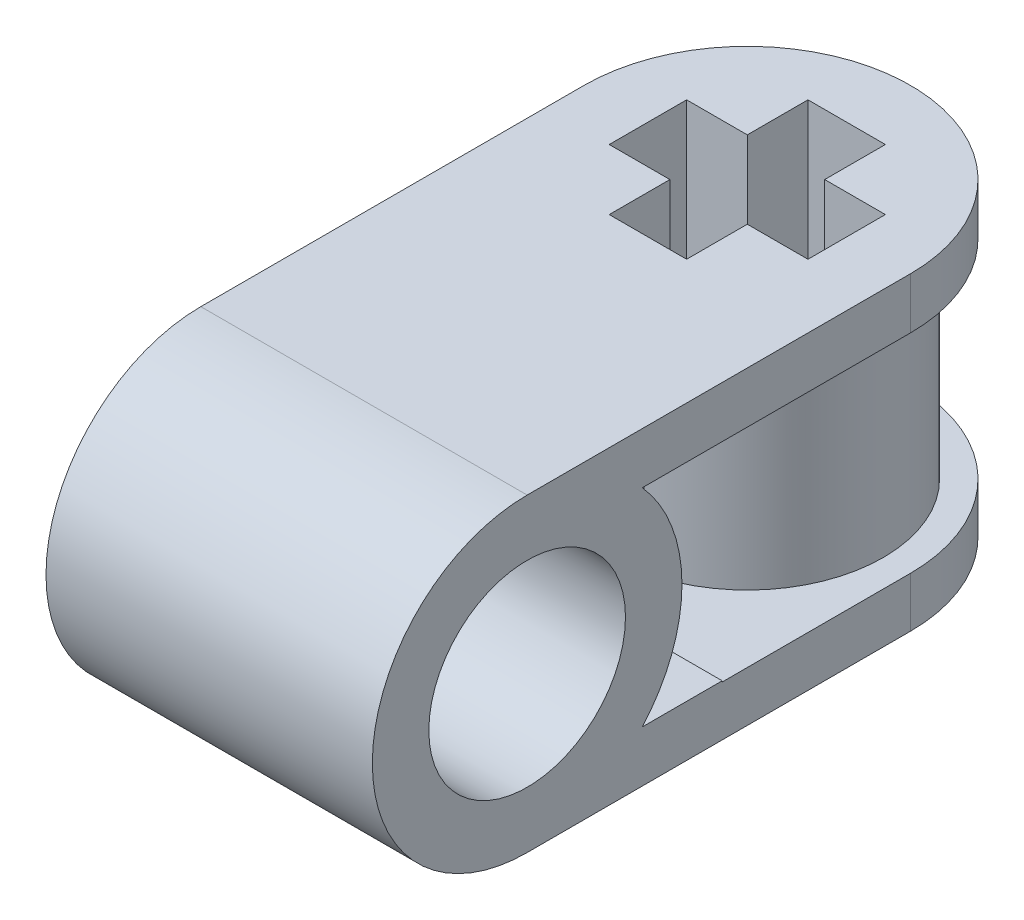
ISO-10303-21;
HEADER;
FILE_DESCRIPTION(('STEP AP214'),'2;1');
FILE_NAME('part.step','',(''),(''),'','','');
FILE_SCHEMA(('AUTOMOTIVE_DESIGN { 1 0 10303 214 1 1 1 1 }'));
ENDSEC;
DATA;
#1=APPLICATION_CONTEXT('core data for automotive mechanical design processes');
#2=APPLICATION_PROTOCOL_DEFINITION('international standard','automotive_design',2000,#1);
#3=PRODUCT_CONTEXT('',#1,'mechanical');
#4=PRODUCT('Part','Part','',(#3));
#5=PRODUCT_RELATED_PRODUCT_CATEGORY('part','',(#4));
#6=PRODUCT_DEFINITION_FORMATION('','',#4);
#7=PRODUCT_DEFINITION_CONTEXT('part definition',#1,'design');
#8=PRODUCT_DEFINITION('design','',#6,#7);
#9=PRODUCT_DEFINITION_SHAPE('','',#8);
#10=(LENGTH_UNIT() NAMED_UNIT(*) SI_UNIT(.MILLI.,.METRE.));
#11=(NAMED_UNIT(*) PLANE_ANGLE_UNIT() SI_UNIT($,.RADIAN.));
#12=(NAMED_UNIT(*) SI_UNIT($,.STERADIAN.) SOLID_ANGLE_UNIT());
#13=UNCERTAINTY_MEASURE_WITH_UNIT(LENGTH_MEASURE(1.E-05),#10,'distance_accuracy_value','');
#14=(GEOMETRIC_REPRESENTATION_CONTEXT(3) GLOBAL_UNCERTAINTY_ASSIGNED_CONTEXT((#13)) GLOBAL_UNIT_ASSIGNED_CONTEXT((#10,
#11,#12)) REPRESENTATION_CONTEXT('',''));
#15=CARTESIAN_POINT('',(0.,0.,0.));
#16=DIRECTION('',(0.,0.,1.));
#17=DIRECTION('',(1.,0.,0.));
#18=AXIS2_PLACEMENT_3D('',#15,#16,#17);
#19=CARTESIAN_POINT('',(7.8,-3.69999873615607,0.));
#20=DIRECTION('',(0.,1.,0.));
#21=DIRECTION('',(0.,0.,1.));
#22=AXIS2_PLACEMENT_3D('',#19,#20,#21);
#23=PLANE('',#22);
#24=DIRECTION('',(1.,0.,0.));
#25=VECTOR('',#24,1.);
#26=CARTESIAN_POINT('',(7.79999999999999,-3.69999873615607,-14.7865384615385));
#27=LINE('',#26,#25);
#28=CARTESIAN_POINT('',(2.975,-3.69999873615607,-14.7865384615385));
#29=VERTEX_POINT('',#28);
#30=CARTESIAN_POINT('',(4.825,-3.69999873615607,-14.7865384615385));
#31=VERTEX_POINT('',#30);
#32=EDGE_CURVE('E410',#29,#31,#27,.T.);
#33=ORIENTED_EDGE('',*,*,#32,.T.);
#34=DIRECTION('',(0.,0.,-1.));
#35=VECTOR('',#34,1.);
#36=CARTESIAN_POINT('',(4.825,-3.69999873615607,0.));
#37=LINE('',#36,#35);
#38=CARTESIAN_POINT('',(4.825,-3.69999873615607,-16.2365384615385));
#39=VERTEX_POINT('',#38);
#40=EDGE_CURVE('E412',#31,#39,#37,.T.);
#41=ORIENTED_EDGE('',*,*,#40,.T.);
#42=DIRECTION('',(-1.,0.,0.));
#43=VECTOR('',#42,1.);
#44=CARTESIAN_POINT('',(7.8,-3.69999873615607,-16.2365384615385));
#45=LINE('',#44,#43);
#46=CARTESIAN_POINT('',(6.275,-3.69999873615607,-16.2365384615385));
#47=VERTEX_POINT('',#46);
#48=EDGE_CURVE('E519',#47,#39,#45,.T.);
#49=ORIENTED_EDGE('',*,*,#48,.F.);
#50=DIRECTION('',(0.,0.,-1.));
#51=VECTOR('',#50,1.);
#52=CARTESIAN_POINT('',(6.275,-3.69999873615607,0.));
#53=LINE('',#52,#51);
#54=CARTESIAN_POINT('',(6.275,-3.69999873615607,-18.0865384615385));
#55=VERTEX_POINT('',#54);
#56=EDGE_CURVE('E541',#47,#55,#53,.T.);
#57=ORIENTED_EDGE('',*,*,#56,.T.);
#58=DIRECTION('',(-1.,0.,0.));
#59=VECTOR('',#58,1.);
#60=CARTESIAN_POINT('',(7.8,-3.69999873615607,-18.0865384615385));
#61=LINE('',#60,#59);
#62=CARTESIAN_POINT('',(4.825,-3.69999873615607,-18.0865384615385));
#63=VERTEX_POINT('',#62);
#64=EDGE_CURVE('E544',#55,#63,#61,.T.);
#65=ORIENTED_EDGE('',*,*,#64,.T.);
#66=DIRECTION('',(0.,0.,-1.));
#67=VECTOR('',#66,1.);
#68=CARTESIAN_POINT('',(4.825,-3.69999873615607,0.));
#69=LINE('',#68,#67);
#70=CARTESIAN_POINT('',(4.825,-3.69999873615607,-19.5365384615385));
#71=VERTEX_POINT('',#70);
#72=EDGE_CURVE('E547',#63,#71,#69,.T.);
#73=ORIENTED_EDGE('',*,*,#72,.T.);
#74=DIRECTION('',(1.,0.,0.));
#75=VECTOR('',#74,1.);
#76=CARTESIAN_POINT('',(7.8,-3.69999873615607,-19.5365384615385));
#77=LINE('',#76,#75);
#78=CARTESIAN_POINT('',(2.975,-3.69999873615607,-19.5365384615385));
#79=VERTEX_POINT('',#78);
#80=EDGE_CURVE('E550',#79,#71,#77,.T.);
#81=ORIENTED_EDGE('',*,*,#80,.F.);
#82=DIRECTION('',(0.,0.,-1.));
#83=VECTOR('',#82,1.);
#84=CARTESIAN_POINT('',(2.975,-3.69999873615607,0.));
#85=LINE('',#84,#83);
#86=CARTESIAN_POINT('',(2.975,-3.69999873615607,-18.0865384615385));
#87=VERTEX_POINT('',#86);
#88=EDGE_CURVE('E552',#87,#79,#85,.T.);
#89=ORIENTED_EDGE('',*,*,#88,.F.);
#90=DIRECTION('',(-1.,0.,0.));
#91=VECTOR('',#90,1.);
#92=CARTESIAN_POINT('',(7.8,-3.69999873615607,-18.0865384615385));
#93=LINE('',#92,#91);
#94=CARTESIAN_POINT('',(1.525,-3.69999873615607,-18.0865384615385));
#95=VERTEX_POINT('',#94);
#96=EDGE_CURVE('E554',#87,#95,#93,.T.);
#97=ORIENTED_EDGE('',*,*,#96,.T.);
#98=DIRECTION('',(0.,0.,-1.));
#99=VECTOR('',#98,1.);
#100=CARTESIAN_POINT('',(1.525,-3.69999873615607,0.));
#101=LINE('',#100,#99);
#102=CARTESIAN_POINT('',(1.525,-3.69999873615607,-16.2365384615385));
#103=VERTEX_POINT('',#102);
#104=EDGE_CURVE('E557',#103,#95,#101,.T.);
#105=ORIENTED_EDGE('',*,*,#104,.F.);
#106=DIRECTION('',(-1.,0.,0.));
#107=VECTOR('',#106,1.);
#108=CARTESIAN_POINT('',(7.8,-3.69999873615607,-16.2365384615385));
#109=LINE('',#108,#107);
#110=CARTESIAN_POINT('',(2.975,-3.69999873615607,-16.2365384615385));
#111=VERTEX_POINT('',#110);
#112=EDGE_CURVE('E420',#111,#103,#109,.T.);
#113=ORIENTED_EDGE('',*,*,#112,.F.);
#114=DIRECTION('',(0.,0.,-1.));
#115=VECTOR('',#114,1.);
#116=CARTESIAN_POINT('',(2.975,-3.69999873615607,0.));
#117=LINE('',#116,#115);
#118=EDGE_CURVE('E414',#29,#111,#117,.T.);
#119=ORIENTED_EDGE('',*,*,#118,.F.);
#120=EDGE_LOOP('',(#33,#41,#49,#57,#65,#73,#81,#89,#97,#105,#113,#119));
#121=FACE_BOUND('',#120,.T.);
#122=DIRECTION('',(1.,0.,0.));
#123=VECTOR('',#122,1.);
#124=CARTESIAN_POINT('',(-2.2,-3.69999873615607,-8.));
#125=LINE('',#124,#123);
#126=CARTESIAN_POINT('',(0.,-3.69999873615607,-8.));
#127=VERTEX_POINT('',#126);
#128=CARTESIAN_POINT('',(7.8,-3.69999873615607,-8.));
#129=VERTEX_POINT('',#128);
#130=EDGE_CURVE('E227',#127,#129,#125,.T.);
#131=ORIENTED_EDGE('',*,*,#130,.F.);
#132=DIRECTION('',(0.,0.,-1.));
#133=VECTOR('',#132,1.);
#134=CARTESIAN_POINT('',(0.,-3.69999873615607,0.));
#135=LINE('',#134,#133);
#136=CARTESIAN_POINT('',(0.,-3.69999873615607,-17.1615384615385));
#137=VERTEX_POINT('',#136);
#138=EDGE_CURVE('E314',#127,#137,#135,.T.);
#139=ORIENTED_EDGE('',*,*,#138,.T.);
#140=CARTESIAN_POINT('',(3.9,-3.69999873615607,-17.1615384615385));
#141=DIRECTION('',(0.,1.,0.));
#142=DIRECTION('',(0.,0.,1.));
#143=AXIS2_PLACEMENT_3D('',#140,#141,#142);
#144=CIRCLE('',#143,3.9);
#145=CARTESIAN_POINT('',(7.8,-3.69999873615607,-17.1615384615385));
#146=VERTEX_POINT('',#145);
#147=EDGE_CURVE('E262',#146,#137,#144,.T.);
#148=ORIENTED_EDGE('',*,*,#147,.F.);
#149=DIRECTION('',(0.,0.,-1.));
#150=VECTOR('',#149,1.);
#151=CARTESIAN_POINT('',(7.8,-3.69999873615607,0.));
#152=LINE('',#151,#150);
#153=EDGE_CURVE('E42',#129,#146,#152,.T.);
#154=ORIENTED_EDGE('',*,*,#153,.F.);
#155=EDGE_LOOP('',(#131,#139,#148,#154));
#156=FACE_BOUND('',#155,.T.);
#157=ADVANCED_FACE('F34',(#121,#156),#23,.F.);
#158=CARTESIAN_POINT('',(7.8,0.,0.));
#159=DIRECTION('',(1.,0.,0.));
#160=DIRECTION('',(0.,0.,-1.));
#161=AXIS2_PLACEMENT_3D('',#158,#159,#160);
#162=PLANE('',#161);
#163=CARTESIAN_POINT('',(7.8,0.,-8.));
#164=DIRECTION('',(1.,0.,0.));
#165=DIRECTION('',(0.,0.,-1.));
#166=AXIS2_PLACEMENT_3D('',#163,#164,#165);
#167=CIRCLE('',#166,2.35);
#168=CARTESIAN_POINT('',(7.8,0.,-10.35));
#169=VERTEX_POINT('',#168);
#170=EDGE_CURVE('E311',#169,#169,#167,.T.);
#171=ORIENTED_EDGE('',*,*,#170,.F.);
#172=EDGE_LOOP('',(#171));
#173=FACE_BOUND('',#172,.T.);
#174=DIRECTION('',(0.,0.,1.));
#175=VECTOR('',#174,1.);
#176=CARTESIAN_POINT('',(7.8,3.69999873615607,0.));
#177=LINE('',#176,#175);
#178=CARTESIAN_POINT('',(7.8,3.69999873615607,-17.1615384615385));
#179=VERTEX_POINT('',#178);
#180=CARTESIAN_POINT('',(7.8,3.69999873615607,-8.));
#181=VERTEX_POINT('',#180);
#182=EDGE_CURVE('E11',#179,#181,#177,.T.);
#183=ORIENTED_EDGE('',*,*,#182,.T.);
#184=CARTESIAN_POINT('',(7.8,0.,-8.));
#185=DIRECTION('',(1.,0.,0.));
#186=DIRECTION('',(0.,0.,-1.));
#187=AXIS2_PLACEMENT_3D('',#184,#185,#186);
#188=CIRCLE('',#187,3.69999873615607);
#189=EDGE_CURVE('E221',#181,#129,#188,.T.);
#190=ORIENTED_EDGE('',*,*,#189,.T.);
#191=ORIENTED_EDGE('',*,*,#153,.T.);
#192=DIRECTION('',(0.,1.,0.));
#193=VECTOR('',#192,1.);
#194=CARTESIAN_POINT('',(7.8,-19.5000012638439,-17.1615384615385));
#195=LINE('',#194,#193);
#196=CARTESIAN_POINT('',(7.8,-2.50000126384393,-17.1615384615385));
#197=VERTEX_POINT('',#196);
#198=EDGE_CURVE('E248',#146,#197,#195,.T.);
#199=ORIENTED_EDGE('',*,*,#198,.T.);
#200=DIRECTION('',(0.,0.,1.));
#201=VECTOR('',#200,1.);
#202=CARTESIAN_POINT('',(7.8,-2.50000126384393,0.));
#203=LINE('',#202,#201);
#204=CARTESIAN_POINT('',(7.8,-2.50000126384393,-12.6615384615385));
#205=VERTEX_POINT('',#204);
#206=EDGE_CURVE('E339',#197,#205,#203,.T.);
#207=ORIENTED_EDGE('',*,*,#206,.T.);
#208=DIRECTION('',(0.,1.,0.));
#209=VECTOR('',#208,1.);
#210=CARTESIAN_POINT('',(7.8,-2.50000126384393,-12.6615384615385));
#211=LINE('',#210,#209);
#212=CARTESIAN_POINT('',(7.8,-2.47537686980316,-12.6615384615385));
#213=VERTEX_POINT('',#212);
#214=EDGE_CURVE('E249',#205,#213,#211,.T.);
#215=ORIENTED_EDGE('',*,*,#214,.T.);
#216=DIRECTION('',(0.,0.,-1.));
#217=VECTOR('',#216,1.);
#218=CARTESIAN_POINT('',(7.8,-2.47537686980316,0.));
#219=LINE('',#218,#217);
#220=CARTESIAN_POINT('',(7.8,-2.47537686980316,-10.75));
#221=VERTEX_POINT('',#220);
#222=EDGE_CURVE('E301',#221,#213,#219,.T.);
#223=ORIENTED_EDGE('',*,*,#222,.F.);
#224=CARTESIAN_POINT('',(7.8,0.,-8.));
#225=DIRECTION('',(1.,0.,0.));
#226=DIRECTION('',(0.,0.,-1.));
#227=AXIS2_PLACEMENT_3D('',#224,#225,#226);
#228=CIRCLE('',#227,3.69999873615607);
#229=CARTESIAN_POINT('',(7.8,2.47537686980316,-10.75));
#230=VERTEX_POINT('',#229);
#231=EDGE_CURVE('E268',#221,#230,#228,.T.);
#232=ORIENTED_EDGE('',*,*,#231,.T.);
#233=DIRECTION('',(0.,0.,-1.));
#234=VECTOR('',#233,1.);
#235=CARTESIAN_POINT('',(7.8,2.47537686980316,0.));
#236=LINE('',#235,#234);
#237=CARTESIAN_POINT('',(7.8,2.47537686980316,-17.1615384615385));
#238=VERTEX_POINT('',#237);
#239=EDGE_CURVE('E244',#230,#238,#236,.T.);
#240=ORIENTED_EDGE('',*,*,#239,.T.);
#241=EDGE_CURVE('E241',#238,#179,#195,.T.);
#242=ORIENTED_EDGE('',*,*,#241,.T.);
#243=EDGE_LOOP('',(#183,#190,#191,#199,#207,#215,#223,#232,#240,#242));
#244=FACE_BOUND('',#243,.T.);
#245=ADVANCED_FACE('F239',(#173,#244),#162,.T.);
#246=CARTESIAN_POINT('',(0.,0.,0.));
#247=DIRECTION('',(1.,0.,0.));
#248=DIRECTION('',(0.,0.,-1.));
#249=AXIS2_PLACEMENT_3D('',#246,#247,#248);
#250=PLANE('',#249);
#251=CARTESIAN_POINT('',(0.,0.,-8.));
#252=DIRECTION('',(1.,0.,0.));
#253=DIRECTION('',(0.,0.,-1.));
#254=AXIS2_PLACEMENT_3D('',#251,#252,#253);
#255=CIRCLE('',#254,2.35);
#256=CARTESIAN_POINT('',(0.,0.,-10.35));
#257=VERTEX_POINT('',#256);
#258=EDGE_CURVE('E230',#257,#257,#255,.T.);
#259=ORIENTED_EDGE('',*,*,#258,.T.);
#260=EDGE_LOOP('',(#259));
#261=FACE_BOUND('',#260,.T.);
#262=CARTESIAN_POINT('',(0.,0.,-8.));
#263=DIRECTION('',(1.,0.,0.));
#264=DIRECTION('',(0.,0.,-1.));
#265=AXIS2_PLACEMENT_3D('',#262,#263,#264);
#266=CIRCLE('',#265,3.69999873615607);
#267=CARTESIAN_POINT('',(0.,3.69999873615607,-8.));
#268=VERTEX_POINT('',#267);
#269=EDGE_CURVE('E266',#268,#127,#266,.T.);
#270=ORIENTED_EDGE('',*,*,#269,.F.);
#271=DIRECTION('',(0.,0.,1.));
#272=VECTOR('',#271,1.);
#273=CARTESIAN_POINT('',(0.,3.69999873615607,0.));
#274=LINE('',#273,#272);
#275=CARTESIAN_POINT('',(0.,3.69999873615607,-17.1615384615385));
#276=VERTEX_POINT('',#275);
#277=EDGE_CURVE('E37',#276,#268,#274,.T.);
#278=ORIENTED_EDGE('',*,*,#277,.F.);
#279=DIRECTION('',(0.,1.,0.));
#280=VECTOR('',#279,1.);
#281=CARTESIAN_POINT('',(0.,-19.5000012638439,-17.1615384615385));
#282=LINE('',#281,#280);
#283=CARTESIAN_POINT('',(0.,2.47537686980316,-17.1615384615385));
#284=VERTEX_POINT('',#283);
#285=EDGE_CURVE('E254',#284,#276,#282,.T.);
#286=ORIENTED_EDGE('',*,*,#285,.F.);
#287=DIRECTION('',(0.,0.,-1.));
#288=VECTOR('',#287,1.);
#289=CARTESIAN_POINT('',(0.,2.47537686980316,0.));
#290=LINE('',#289,#288);
#291=CARTESIAN_POINT('',(0.,2.47537686980316,-10.75));
#292=VERTEX_POINT('',#291);
#293=EDGE_CURVE('E281',#292,#284,#290,.T.);
#294=ORIENTED_EDGE('',*,*,#293,.F.);
#295=CARTESIAN_POINT('',(0.,0.,-8.));
#296=DIRECTION('',(1.,0.,0.));
#297=DIRECTION('',(0.,0.,-1.));
#298=AXIS2_PLACEMENT_3D('',#295,#296,#297);
#299=CIRCLE('',#298,3.69999873615607);
#300=CARTESIAN_POINT('',(0.,-2.47537686980316,-10.75));
#301=VERTEX_POINT('',#300);
#302=EDGE_CURVE('E265',#301,#292,#299,.T.);
#303=ORIENTED_EDGE('',*,*,#302,.F.);
#304=DIRECTION('',(0.,0.,-1.));
#305=VECTOR('',#304,1.);
#306=CARTESIAN_POINT('',(0.,-2.47537686980316,0.));
#307=LINE('',#306,#305);
#308=CARTESIAN_POINT('',(0.,-2.47537686980316,-12.6615384615385));
#309=VERTEX_POINT('',#308);
#310=EDGE_CURVE('E274',#301,#309,#307,.T.);
#311=ORIENTED_EDGE('',*,*,#310,.T.);
#312=DIRECTION('',(0.,1.,0.));
#313=VECTOR('',#312,1.);
#314=CARTESIAN_POINT('',(0.,-2.50000126384393,-12.6615384615385));
#315=LINE('',#314,#313);
#316=CARTESIAN_POINT('',(0.,-2.50000126384393,-12.6615384615385));
#317=VERTEX_POINT('',#316);
#318=EDGE_CURVE('E331',#317,#309,#315,.T.);
#319=ORIENTED_EDGE('',*,*,#318,.F.);
#320=DIRECTION('',(0.,0.,1.));
#321=VECTOR('',#320,1.);
#322=CARTESIAN_POINT('',(0.,-2.50000126384393,0.));
#323=LINE('',#322,#321);
#324=CARTESIAN_POINT('',(0.,-2.50000126384393,-17.1615384615385));
#325=VERTEX_POINT('',#324);
#326=EDGE_CURVE('E330',#325,#317,#323,.T.);
#327=ORIENTED_EDGE('',*,*,#326,.F.);
#328=EDGE_CURVE('E256',#137,#325,#282,.T.);
#329=ORIENTED_EDGE('',*,*,#328,.F.);
#330=ORIENTED_EDGE('',*,*,#138,.F.);
#331=EDGE_LOOP('',(#270,#278,#286,#294,#303,#311,#319,#327,#329,#330));
#332=FACE_BOUND('',#331,.T.);
#333=ADVANCED_FACE('F327',(#261,#332),#250,.F.);
#334=CARTESIAN_POINT('',(3.9,-19.5000012638439,-17.1615384615385));
#335=DIRECTION('',(0.,1.,0.));
#336=DIRECTION('',(0.,0.,1.));
#337=AXIS2_PLACEMENT_3D('',#334,#335,#336);
#338=CYLINDRICAL_SURFACE('',#337,3.9);
#339=ORIENTED_EDGE('',*,*,#328,.T.);
#340=CARTESIAN_POINT('',(3.9,-2.50000126384393,-17.1615384615385));
#341=DIRECTION('',(0.,1.,0.));
#342=DIRECTION('',(0.,0.,1.));
#343=AXIS2_PLACEMENT_3D('',#340,#341,#342);
#344=CIRCLE('',#343,3.9);
#345=EDGE_CURVE('E335',#197,#325,#344,.T.);
#346=ORIENTED_EDGE('',*,*,#345,.F.);
#347=ORIENTED_EDGE('',*,*,#198,.F.);
#348=ORIENTED_EDGE('',*,*,#147,.T.);
#349=EDGE_LOOP('',(#339,#346,#347,#348));
#350=FACE_BOUND('',#349,.T.);
#351=ADVANCED_FACE('F324',(#350),#338,.T.);
#352=CARTESIAN_POINT('',(7.8,3.69999873615607,0.));
#353=DIRECTION('',(0.,-1.,0.));
#354=DIRECTION('',(0.,0.,-1.));
#355=AXIS2_PLACEMENT_3D('',#352,#353,#354);
#356=PLANE('',#355);
#357=DIRECTION('',(-1.,0.,0.));
#358=VECTOR('',#357,1.);
#359=CARTESIAN_POINT('',(0.,3.69999873615607,-16.2365384615385));
#360=LINE('',#359,#358);
#361=CARTESIAN_POINT('',(6.275,3.69999873615607,-16.2365384615385));
#362=VERTEX_POINT('',#361);
#363=CARTESIAN_POINT('',(4.825,3.69999873615607,-16.2365384615385));
#364=VERTEX_POINT('',#363);
#365=EDGE_CURVE('E480',#362,#364,#360,.T.);
#366=ORIENTED_EDGE('',*,*,#365,.T.);
#367=DIRECTION('',(0.,0.,-1.));
#368=VECTOR('',#367,1.);
#369=CARTESIAN_POINT('',(4.825,3.69999873615607,0.));
#370=LINE('',#369,#368);
#371=CARTESIAN_POINT('',(4.825,3.69999873615607,-14.7865384615385));
#372=VERTEX_POINT('',#371);
#373=EDGE_CURVE('E58',#372,#364,#370,.T.);
#374=ORIENTED_EDGE('',*,*,#373,.F.);
#375=DIRECTION('',(1.,0.,0.));
#376=VECTOR('',#375,1.);
#377=CARTESIAN_POINT('',(0.,3.69999873615607,-14.7865384615385));
#378=LINE('',#377,#376);
#379=CARTESIAN_POINT('',(2.975,3.69999873615607,-14.7865384615385));
#380=VERTEX_POINT('',#379);
#381=EDGE_CURVE('E513',#380,#372,#378,.T.);
#382=ORIENTED_EDGE('',*,*,#381,.F.);
#383=DIRECTION('',(0.,0.,-1.));
#384=VECTOR('',#383,1.);
#385=CARTESIAN_POINT('',(2.975,3.69999873615607,0.));
#386=LINE('',#385,#384);
#387=CARTESIAN_POINT('',(2.975,3.69999873615607,-16.2365384615385));
#388=VERTEX_POINT('',#387);
#389=EDGE_CURVE('E510',#380,#388,#386,.T.);
#390=ORIENTED_EDGE('',*,*,#389,.T.);
#391=DIRECTION('',(-1.,0.,0.));
#392=VECTOR('',#391,1.);
#393=CARTESIAN_POINT('',(0.,3.69999873615607,-16.2365384615385));
#394=LINE('',#393,#392);
#395=CARTESIAN_POINT('',(1.525,3.69999873615607,-16.2365384615385));
#396=VERTEX_POINT('',#395);
#397=EDGE_CURVE('E507',#388,#396,#394,.T.);
#398=ORIENTED_EDGE('',*,*,#397,.T.);
#399=DIRECTION('',(0.,0.,-1.));
#400=VECTOR('',#399,1.);
#401=CARTESIAN_POINT('',(1.525,3.69999873615607,0.));
#402=LINE('',#401,#400);
#403=CARTESIAN_POINT('',(1.525,3.69999873615607,-18.0865384615385));
#404=VERTEX_POINT('',#403);
#405=EDGE_CURVE('E504',#396,#404,#402,.T.);
#406=ORIENTED_EDGE('',*,*,#405,.T.);
#407=DIRECTION('',(-1.,0.,0.));
#408=VECTOR('',#407,1.);
#409=CARTESIAN_POINT('',(0.,3.69999873615607,-18.0865384615385));
#410=LINE('',#409,#408);
#411=CARTESIAN_POINT('',(2.975,3.69999873615607,-18.0865384615385));
#412=VERTEX_POINT('',#411);
#413=EDGE_CURVE('E501',#412,#404,#410,.T.);
#414=ORIENTED_EDGE('',*,*,#413,.F.);
#415=DIRECTION('',(0.,0.,-1.));
#416=VECTOR('',#415,1.);
#417=CARTESIAN_POINT('',(2.975,3.69999873615607,0.));
#418=LINE('',#417,#416);
#419=CARTESIAN_POINT('',(2.975,3.69999873615607,-19.5365384615385));
#420=VERTEX_POINT('',#419);
#421=EDGE_CURVE('E498',#412,#420,#418,.T.);
#422=ORIENTED_EDGE('',*,*,#421,.T.);
#423=DIRECTION('',(1.,0.,0.));
#424=VECTOR('',#423,1.);
#425=CARTESIAN_POINT('',(0.,3.69999873615607,-19.5365384615385));
#426=LINE('',#425,#424);
#427=CARTESIAN_POINT('',(4.825,3.69999873615607,-19.5365384615385));
#428=VERTEX_POINT('',#427);
#429=EDGE_CURVE('E495',#420,#428,#426,.T.);
#430=ORIENTED_EDGE('',*,*,#429,.T.);
#431=DIRECTION('',(0.,0.,-1.));
#432=VECTOR('',#431,1.);
#433=CARTESIAN_POINT('',(4.825,3.69999873615607,0.));
#434=LINE('',#433,#432);
#435=CARTESIAN_POINT('',(4.825,3.69999873615607,-18.0865384615385));
#436=VERTEX_POINT('',#435);
#437=EDGE_CURVE('E492',#436,#428,#434,.T.);
#438=ORIENTED_EDGE('',*,*,#437,.F.);
#439=DIRECTION('',(-1.,0.,0.));
#440=VECTOR('',#439,1.);
#441=CARTESIAN_POINT('',(0.,3.69999873615607,-18.0865384615385));
#442=LINE('',#441,#440);
#443=CARTESIAN_POINT('',(6.275,3.69999873615607,-18.0865384615385));
#444=VERTEX_POINT('',#443);
#445=EDGE_CURVE('E486',#444,#436,#442,.T.);
#446=ORIENTED_EDGE('',*,*,#445,.F.);
#447=DIRECTION('',(0.,0.,-1.));
#448=VECTOR('',#447,1.);
#449=CARTESIAN_POINT('',(6.275,3.69999873615607,0.));
#450=LINE('',#449,#448);
#451=EDGE_CURVE('E484',#362,#444,#450,.T.);
#452=ORIENTED_EDGE('',*,*,#451,.F.);
#453=EDGE_LOOP('',(#366,#374,#382,#390,#398,#406,#414,#422,#430,#438,#446,#452));
#454=FACE_BOUND('',#453,.T.);
#455=ORIENTED_EDGE('',*,*,#277,.T.);
#456=DIRECTION('',(1.,0.,0.));
#457=VECTOR('',#456,1.);
#458=CARTESIAN_POINT('',(-2.2,3.69999873615607,-8.));
#459=LINE('',#458,#457);
#460=EDGE_CURVE('E224',#268,#181,#459,.T.);
#461=ORIENTED_EDGE('',*,*,#460,.T.);
#462=ORIENTED_EDGE('',*,*,#182,.F.);
#463=CARTESIAN_POINT('',(3.9,3.69999873615607,-17.1615384615385));
#464=DIRECTION('',(0.,1.,0.));
#465=DIRECTION('',(0.,0.,1.));
#466=AXIS2_PLACEMENT_3D('',#463,#464,#465);
#467=CIRCLE('',#466,3.9);
#468=EDGE_CURVE('E251',#179,#276,#467,.T.);
#469=ORIENTED_EDGE('',*,*,#468,.T.);
#470=EDGE_LOOP('',(#455,#461,#462,#469));
#471=FACE_BOUND('',#470,.T.);
#472=ADVANCED_FACE('F235',(#454,#471),#356,.F.);
#473=CARTESIAN_POINT('',(7.8,0.,-8.));
#474=DIRECTION('',(-1.,0.,0.));
#475=DIRECTION('',(0.,0.,1.));
#476=AXIS2_PLACEMENT_3D('',#473,#474,#475);
#477=CYLINDRICAL_SURFACE('',#476,2.35);
#478=ORIENTED_EDGE('',*,*,#170,.T.);
#479=EDGE_LOOP('',(#478));
#480=FACE_BOUND('',#479,.T.);
#481=ORIENTED_EDGE('',*,*,#258,.F.);
#482=EDGE_LOOP('',(#481));
#483=FACE_BOUND('',#482,.T.);
#484=ADVANCED_FACE('F467',(#480,#483),#477,.F.);
#485=CARTESIAN_POINT('',(4.6,0.,-8.));
#486=DIRECTION('',(1.,0.,0.));
#487=DIRECTION('',(0.,0.,-1.));
#488=AXIS2_PLACEMENT_3D('',#485,#486,#487);
#489=CYLINDRICAL_SURFACE('',#488,3.69999873615607);
#490=ORIENTED_EDGE('',*,*,#231,.F.);
#491=DIRECTION('',(1.,0.,0.));
#492=VECTOR('',#491,1.);
#493=CARTESIAN_POINT('',(4.6,-2.47537686980316,-10.75));
#494=LINE('',#493,#492);
#495=CARTESIAN_POINT('',(4.6,-2.47537686980316,-10.75));
#496=VERTEX_POINT('',#495);
#497=EDGE_CURVE('E299',#496,#221,#494,.T.);
#498=ORIENTED_EDGE('',*,*,#497,.F.);
#499=CARTESIAN_POINT('',(4.6,0.,-8.));
#500=DIRECTION('',(1.,0.,0.));
#501=DIRECTION('',(0.,0.,-1.));
#502=AXIS2_PLACEMENT_3D('',#499,#500,#501);
#503=CIRCLE('',#502,3.69999873615607);
#504=CARTESIAN_POINT('',(4.6,2.47537686980316,-10.75));
#505=VERTEX_POINT('',#504);
#506=EDGE_CURVE('E291',#496,#505,#503,.T.);
#507=ORIENTED_EDGE('',*,*,#506,.T.);
#508=DIRECTION('',(1.,0.,0.));
#509=VECTOR('',#508,1.);
#510=CARTESIAN_POINT('',(4.6,2.47537686980316,-10.75));
#511=LINE('',#510,#509);
#512=EDGE_CURVE('E231',#505,#230,#511,.T.);
#513=ORIENTED_EDGE('',*,*,#512,.T.);
#514=EDGE_LOOP('',(#490,#498,#507,#513));
#515=FACE_BOUND('',#514,.T.);
#516=ADVANCED_FACE('F435',(#515),#489,.T.);
#517=CARTESIAN_POINT('',(4.6,2.47537686980316,0.));
#518=DIRECTION('',(0.,-1.,0.));
#519=DIRECTION('',(0.,0.,-1.));
#520=AXIS2_PLACEMENT_3D('',#517,#518,#519);
#521=PLANE('',#520);
#522=ORIENTED_EDGE('',*,*,#239,.F.);
#523=ORIENTED_EDGE('',*,*,#512,.F.);
#524=DIRECTION('',(0.,0.,-1.));
#525=VECTOR('',#524,1.);
#526=CARTESIAN_POINT('',(4.6,2.47537686980316,0.));
#527=LINE('',#526,#525);
#528=CARTESIAN_POINT('',(4.6,2.47537686980316,-13.9878182470268));
#529=VERTEX_POINT('',#528);
#530=EDGE_CURVE('E297',#505,#529,#527,.T.);
#531=ORIENTED_EDGE('',*,*,#530,.T.);
#532=CARTESIAN_POINT('',(3.9,2.47537686980316,-17.1615384615385));
#533=DIRECTION('',(0.,1.,0.));
#534=DIRECTION('',(0.,0.,1.));
#535=AXIS2_PLACEMENT_3D('',#532,#533,#534);
#536=CIRCLE('',#535,3.25);
#537=CARTESIAN_POINT('',(3.2,2.47537686980316,-13.9878182470268));
#538=VERTEX_POINT('',#537);
#539=EDGE_CURVE('E380',#529,#538,#536,.T.);
#540=ORIENTED_EDGE('',*,*,#539,.T.);
#541=DIRECTION('',(0.,0.,-1.));
#542=VECTOR('',#541,1.);
#543=CARTESIAN_POINT('',(3.2,2.47537686980316,0.));
#544=LINE('',#543,#542);
#545=CARTESIAN_POINT('',(3.2,2.47537686980316,-10.75));
#546=VERTEX_POINT('',#545);
#547=EDGE_CURVE('E273',#546,#538,#544,.T.);
#548=ORIENTED_EDGE('',*,*,#547,.F.);
#549=DIRECTION('',(-1.,0.,0.));
#550=VECTOR('',#549,1.);
#551=CARTESIAN_POINT('',(3.2,2.47537686980316,-10.75));
#552=LINE('',#551,#550);
#553=EDGE_CURVE('E279',#546,#292,#552,.T.);
#554=ORIENTED_EDGE('',*,*,#553,.T.);
#555=ORIENTED_EDGE('',*,*,#293,.T.);
#556=CARTESIAN_POINT('',(3.9,2.47537686980316,-17.1615384615385));
#557=DIRECTION('',(0.,1.,0.));
#558=DIRECTION('',(0.,0.,1.));
#559=AXIS2_PLACEMENT_3D('',#556,#557,#558);
#560=CIRCLE('',#559,3.9);
#561=EDGE_CURVE('E424',#284,#238,#560,.F.);
#562=ORIENTED_EDGE('',*,*,#561,.T.);
#563=EDGE_LOOP('',(#522,#523,#531,#540,#548,#554,#555,#562));
#564=FACE_BOUND('',#563,.T.);
#565=ADVANCED_FACE('F377',(#564),#521,.T.);
#566=CARTESIAN_POINT('',(4.6,-2.47537686980316,0.));
#567=DIRECTION('',(0.,-1.,0.));
#568=DIRECTION('',(0.,0.,-1.));
#569=AXIS2_PLACEMENT_3D('',#566,#567,#568);
#570=PLANE('',#569);
#571=ORIENTED_EDGE('',*,*,#222,.T.);
#572=DIRECTION('',(1.,0.,0.));
#573=VECTOR('',#572,1.);
#574=CARTESIAN_POINT('',(4.6,-2.47537686980316,-12.6615384615385));
#575=LINE('',#574,#573);
#576=CARTESIAN_POINT('',(4.6,-2.47537686980316,-12.6615384615385));
#577=VERTEX_POINT('',#576);
#578=EDGE_CURVE('E307',#577,#213,#575,.T.);
#579=ORIENTED_EDGE('',*,*,#578,.F.);
#580=DIRECTION('',(0.,0.,-1.));
#581=VECTOR('',#580,1.);
#582=CARTESIAN_POINT('',(4.6,-2.47537686980316,0.));
#583=LINE('',#582,#581);
#584=EDGE_CURVE('E294',#496,#577,#583,.T.);
#585=ORIENTED_EDGE('',*,*,#584,.F.);
#586=ORIENTED_EDGE('',*,*,#497,.T.);
#587=EDGE_LOOP('',(#571,#579,#585,#586));
#588=FACE_BOUND('',#587,.T.);
#589=ADVANCED_FACE('F431',(#588),#570,.F.);
#590=CARTESIAN_POINT('',(4.6,0.,0.));
#591=DIRECTION('',(1.,0.,0.));
#592=DIRECTION('',(0.,0.,-1.));
#593=AXIS2_PLACEMENT_3D('',#590,#591,#592);
#594=PLANE('',#593);
#595=ORIENTED_EDGE('',*,*,#506,.F.);
#596=ORIENTED_EDGE('',*,*,#584,.T.);
#597=DIRECTION('',(0.,1.,0.));
#598=VECTOR('',#597,1.);
#599=CARTESIAN_POINT('',(4.6,-2.50000126384393,-12.6615384615385));
#600=LINE('',#599,#598);
#601=CARTESIAN_POINT('',(4.6,-2.50000126384393,-12.6615384615385));
#602=VERTEX_POINT('',#601);
#603=EDGE_CURVE('E354',#602,#577,#600,.T.);
#604=ORIENTED_EDGE('',*,*,#603,.F.);
#605=DIRECTION('',(0.,0.,-1.));
#606=VECTOR('',#605,1.);
#607=CARTESIAN_POINT('',(4.6,-2.50000126384393,0.));
#608=LINE('',#607,#606);
#609=CARTESIAN_POINT('',(4.6,-2.50000126384393,-13.9878182470268));
#610=VERTEX_POINT('',#609);
#611=EDGE_CURVE('E347',#602,#610,#608,.T.);
#612=ORIENTED_EDGE('',*,*,#611,.T.);
#613=DIRECTION('',(0.,1.,0.));
#614=VECTOR('',#613,1.);
#615=CARTESIAN_POINT('',(4.6,-2.50000126384393,-13.9878182470268));
#616=LINE('',#615,#614);
#617=EDGE_CURVE('E356',#610,#529,#616,.T.);
#618=ORIENTED_EDGE('',*,*,#617,.T.);
#619=ORIENTED_EDGE('',*,*,#530,.F.);
#620=EDGE_LOOP('',(#595,#596,#604,#612,#618,#619));
#621=FACE_BOUND('',#620,.T.);
#622=ADVANCED_FACE('F438',(#621),#594,.T.);
#623=CARTESIAN_POINT('',(4.6,0.,-8.));
#624=DIRECTION('',(1.,0.,0.));
#625=DIRECTION('',(0.,0.,-1.));
#626=AXIS2_PLACEMENT_3D('',#623,#624,#625);
#627=CYLINDRICAL_SURFACE('',#626,3.69999873615607);
#628=ORIENTED_EDGE('',*,*,#130,.T.);
#629=ORIENTED_EDGE('',*,*,#189,.F.);
#630=ORIENTED_EDGE('',*,*,#460,.F.);
#631=ORIENTED_EDGE('',*,*,#269,.T.);
#632=EDGE_LOOP('',(#628,#629,#630,#631));
#633=FACE_BOUND('',#632,.T.);
#634=ADVANCED_FACE('F223',(#633),#627,.T.);
#635=CARTESIAN_POINT('',(3.2,0.,-8.));
#636=DIRECTION('',(-1.,0.,0.));
#637=DIRECTION('',(0.,0.,1.));
#638=AXIS2_PLACEMENT_3D('',#635,#636,#637);
#639=CYLINDRICAL_SURFACE('',#638,3.69999873615607);
#640=ORIENTED_EDGE('',*,*,#302,.T.);
#641=ORIENTED_EDGE('',*,*,#553,.F.);
#642=CARTESIAN_POINT('',(3.2,0.,-8.));
#643=DIRECTION('',(1.,0.,0.));
#644=DIRECTION('',(0.,0.,-1.));
#645=AXIS2_PLACEMENT_3D('',#642,#643,#644);
#646=CIRCLE('',#645,3.69999873615607);
#647=CARTESIAN_POINT('',(3.2,-2.47537686980316,-10.75));
#648=VERTEX_POINT('',#647);
#649=EDGE_CURVE('E270',#648,#546,#646,.T.);
#650=ORIENTED_EDGE('',*,*,#649,.F.);
#651=DIRECTION('',(-1.,0.,0.));
#652=VECTOR('',#651,1.);
#653=CARTESIAN_POINT('',(3.2,-2.47537686980316,-10.75));
#654=LINE('',#653,#652);
#655=EDGE_CURVE('E269',#648,#301,#654,.T.);
#656=ORIENTED_EDGE('',*,*,#655,.T.);
#657=EDGE_LOOP('',(#640,#641,#650,#656));
#658=FACE_BOUND('',#657,.T.);
#659=ADVANCED_FACE('F373',(#658),#639,.T.);
#660=CARTESIAN_POINT('',(3.2,-2.47537686980316,0.));
#661=DIRECTION('',(0.,1.,0.));
#662=DIRECTION('',(0.,0.,1.));
#663=AXIS2_PLACEMENT_3D('',#660,#661,#662);
#664=PLANE('',#663);
#665=ORIENTED_EDGE('',*,*,#310,.F.);
#666=ORIENTED_EDGE('',*,*,#655,.F.);
#667=DIRECTION('',(0.,0.,-1.));
#668=VECTOR('',#667,1.);
#669=CARTESIAN_POINT('',(3.2,-2.47537686980316,0.));
#670=LINE('',#669,#668);
#671=CARTESIAN_POINT('',(3.2,-2.47537686980316,-12.6615384615385));
#672=VERTEX_POINT('',#671);
#673=EDGE_CURVE('E276',#648,#672,#670,.T.);
#674=ORIENTED_EDGE('',*,*,#673,.T.);
#675=DIRECTION('',(-1.,0.,0.));
#676=VECTOR('',#675,1.);
#677=CARTESIAN_POINT('',(3.2,-2.47537686980316,-12.6615384615385));
#678=LINE('',#677,#676);
#679=EDGE_CURVE('E286',#672,#309,#678,.T.);
#680=ORIENTED_EDGE('',*,*,#679,.T.);
#681=EDGE_LOOP('',(#665,#666,#674,#680));
#682=FACE_BOUND('',#681,.T.);
#683=ADVANCED_FACE('F368',(#682),#664,.T.);
#684=CARTESIAN_POINT('',(3.2,0.,0.));
#685=DIRECTION('',(-1.,0.,0.));
#686=DIRECTION('',(0.,0.,-1.));
#687=AXIS2_PLACEMENT_3D('',#684,#685,#686);
#688=PLANE('',#687);
#689=ORIENTED_EDGE('',*,*,#649,.T.);
#690=ORIENTED_EDGE('',*,*,#547,.T.);
#691=DIRECTION('',(0.,1.,0.));
#692=VECTOR('',#691,1.);
#693=CARTESIAN_POINT('',(3.2,-2.50000126384393,-13.9878182470268));
#694=LINE('',#693,#692);
#695=CARTESIAN_POINT('',(3.2,-2.50000126384393,-13.9878182470268));
#696=VERTEX_POINT('',#695);
#697=EDGE_CURVE('E359',#696,#538,#694,.T.);
#698=ORIENTED_EDGE('',*,*,#697,.F.);
#699=DIRECTION('',(0.,0.,-1.));
#700=VECTOR('',#699,1.);
#701=CARTESIAN_POINT('',(3.2,-2.50000126384393,0.));
#702=LINE('',#701,#700);
#703=CARTESIAN_POINT('',(3.2,-2.50000126384393,-12.6615384615385));
#704=VERTEX_POINT('',#703);
#705=EDGE_CURVE('E337',#704,#696,#702,.T.);
#706=ORIENTED_EDGE('',*,*,#705,.F.);
#707=DIRECTION('',(0.,1.,0.));
#708=VECTOR('',#707,1.);
#709=CARTESIAN_POINT('',(3.2,-2.50000126384393,-12.6615384615385));
#710=LINE('',#709,#708);
#711=EDGE_CURVE('E362',#704,#672,#710,.T.);
#712=ORIENTED_EDGE('',*,*,#711,.T.);
#713=ORIENTED_EDGE('',*,*,#673,.F.);
#714=EDGE_LOOP('',(#689,#690,#698,#706,#712,#713));
#715=FACE_BOUND('',#714,.T.);
#716=ADVANCED_FACE('F383',(#715),#688,.T.);
#717=ORIENTED_EDGE('',*,*,#561,.F.);
#718=ORIENTED_EDGE('',*,*,#285,.T.);
#719=ORIENTED_EDGE('',*,*,#468,.F.);
#720=ORIENTED_EDGE('',*,*,#241,.F.);
#721=EDGE_LOOP('',(#717,#718,#719,#720));
#722=FACE_BOUND('',#721,.T.);
#723=ADVANCED_FACE('F252',(#722),#338,.T.);
#724=CARTESIAN_POINT('',(0.,-2.50000126384393,-12.6615384615385));
#725=DIRECTION('',(0.,0.,1.));
#726=DIRECTION('',(0.,-1.,0.));
#727=AXIS2_PLACEMENT_3D('',#724,#725,#726);
#728=PLANE('',#727);
#729=ORIENTED_EDGE('',*,*,#214,.F.);
#730=DIRECTION('',(1.,0.,0.));
#731=VECTOR('',#730,1.);
#732=CARTESIAN_POINT('',(0.,-2.50000126384393,-12.6615384615385));
#733=LINE('',#732,#731);
#734=EDGE_CURVE('E349',#602,#205,#733,.T.);
#735=ORIENTED_EDGE('',*,*,#734,.F.);
#736=ORIENTED_EDGE('',*,*,#603,.T.);
#737=ORIENTED_EDGE('',*,*,#578,.T.);
#738=EDGE_LOOP('',(#729,#735,#736,#737));
#739=FACE_BOUND('',#738,.T.);
#740=ADVANCED_FACE('F442',(#739),#728,.F.);
#741=CARTESIAN_POINT('',(3.9,-2.50000126384393,-17.1615384615385));
#742=DIRECTION('',(0.,1.,0.));
#743=DIRECTION('',(0.,0.,1.));
#744=AXIS2_PLACEMENT_3D('',#741,#742,#743);
#745=CYLINDRICAL_SURFACE('',#744,3.25);
#746=ORIENTED_EDGE('',*,*,#697,.T.);
#747=ORIENTED_EDGE('',*,*,#539,.F.);
#748=ORIENTED_EDGE('',*,*,#617,.F.);
#749=CARTESIAN_POINT('',(3.9,-2.50000126384393,-17.1615384615385));
#750=DIRECTION('',(0.,1.,0.));
#751=DIRECTION('',(0.,0.,1.));
#752=AXIS2_PLACEMENT_3D('',#749,#750,#751);
#753=CIRCLE('',#752,3.25);
#754=EDGE_CURVE('E345',#610,#696,#753,.T.);
#755=ORIENTED_EDGE('',*,*,#754,.T.);
#756=EDGE_LOOP('',(#746,#747,#748,#755));
#757=FACE_BOUND('',#756,.T.);
#758=ADVANCED_FACE('F397',(#757),#745,.T.);
#759=CARTESIAN_POINT('',(0.,-2.50000126384393,-12.6615384615385));
#760=DIRECTION('',(0.,0.,1.));
#761=DIRECTION('',(0.,-1.,0.));
#762=AXIS2_PLACEMENT_3D('',#759,#760,#761);
#763=PLANE('',#762);
#764=ORIENTED_EDGE('',*,*,#679,.F.);
#765=ORIENTED_EDGE('',*,*,#711,.F.);
#766=DIRECTION('',(1.,0.,0.));
#767=VECTOR('',#766,1.);
#768=CARTESIAN_POINT('',(0.,-2.50000126384393,-12.6615384615385));
#769=LINE('',#768,#767);
#770=EDGE_CURVE('E334',#317,#704,#769,.T.);
#771=ORIENTED_EDGE('',*,*,#770,.F.);
#772=ORIENTED_EDGE('',*,*,#318,.T.);
#773=EDGE_LOOP('',(#764,#765,#771,#772));
#774=FACE_BOUND('',#773,.T.);
#775=ADVANCED_FACE('F365',(#774),#763,.F.);
#776=CARTESIAN_POINT('',(0.,-2.50000126384393,0.));
#777=DIRECTION('',(0.,1.,0.));
#778=DIRECTION('',(0.,0.,1.));
#779=AXIS2_PLACEMENT_3D('',#776,#777,#778);
#780=PLANE('',#779);
#781=ORIENTED_EDGE('',*,*,#206,.F.);
#782=ORIENTED_EDGE('',*,*,#345,.T.);
#783=ORIENTED_EDGE('',*,*,#326,.T.);
#784=ORIENTED_EDGE('',*,*,#770,.T.);
#785=ORIENTED_EDGE('',*,*,#705,.T.);
#786=ORIENTED_EDGE('',*,*,#754,.F.);
#787=ORIENTED_EDGE('',*,*,#611,.F.);
#788=ORIENTED_EDGE('',*,*,#734,.T.);
#789=EDGE_LOOP('',(#781,#782,#783,#784,#785,#786,#787,#788));
#790=FACE_BOUND('',#789,.T.);
#791=ADVANCED_FACE('F386',(#790),#780,.T.);
#792=CARTESIAN_POINT('',(4.825,-20.9500012638439,0.));
#793=DIRECTION('',(1.,0.,0.));
#794=DIRECTION('',(0.,0.,-1.));
#795=AXIS2_PLACEMENT_3D('',#792,#793,#794);
#796=PLANE('',#795);
#797=DIRECTION('',(0.,1.,0.));
#798=VECTOR('',#797,1.);
#799=CARTESIAN_POINT('',(4.825,-20.9500012638439,-14.7865384615385));
#800=LINE('',#799,#798);
#801=EDGE_CURVE('E517',#31,#372,#800,.T.);
#802=ORIENTED_EDGE('',*,*,#801,.T.);
#803=ORIENTED_EDGE('',*,*,#373,.T.);
#804=DIRECTION('',(0.,1.,0.));
#805=VECTOR('',#804,1.);
#806=CARTESIAN_POINT('',(4.825,-20.9500012638439,-16.2365384615385));
#807=LINE('',#806,#805);
#808=EDGE_CURVE('E516',#39,#364,#807,.T.);
#809=ORIENTED_EDGE('',*,*,#808,.F.);
#810=ORIENTED_EDGE('',*,*,#40,.F.);
#811=EDGE_LOOP('',(#802,#803,#809,#810));
#812=FACE_BOUND('',#811,.T.);
#813=ADVANCED_FACE('F389',(#812),#796,.F.);
#814=CARTESIAN_POINT('',(0.,-20.9500012638439,-14.7865384615385));
#815=DIRECTION('',(0.,0.,1.));
#816=DIRECTION('',(1.,0.,0.));
#817=AXIS2_PLACEMENT_3D('',#814,#815,#816);
#818=PLANE('',#817);
#819=DIRECTION('',(0.,1.,0.));
#820=VECTOR('',#819,1.);
#821=CARTESIAN_POINT('',(2.975,-20.9500012638439,-14.7865384615385));
#822=LINE('',#821,#820);
#823=EDGE_CURVE('E520',#29,#380,#822,.T.);
#824=ORIENTED_EDGE('',*,*,#823,.T.);
#825=ORIENTED_EDGE('',*,*,#381,.T.);
#826=ORIENTED_EDGE('',*,*,#801,.F.);
#827=ORIENTED_EDGE('',*,*,#32,.F.);
#828=EDGE_LOOP('',(#824,#825,#826,#827));
#829=FACE_BOUND('',#828,.T.);
#830=ADVANCED_FACE('F395',(#829),#818,.F.);
#831=CARTESIAN_POINT('',(2.975,-20.9500012638439,0.));
#832=DIRECTION('',(1.,0.,0.));
#833=DIRECTION('',(0.,0.,-1.));
#834=AXIS2_PLACEMENT_3D('',#831,#832,#833);
#835=PLANE('',#834);
#836=ORIENTED_EDGE('',*,*,#118,.T.);
#837=DIRECTION('',(0.,1.,0.));
#838=VECTOR('',#837,1.);
#839=CARTESIAN_POINT('',(2.975,-20.9500012638439,-16.2365384615385));
#840=LINE('',#839,#838);
#841=EDGE_CURVE('E522',#111,#388,#840,.T.);
#842=ORIENTED_EDGE('',*,*,#841,.T.);
#843=ORIENTED_EDGE('',*,*,#389,.F.);
#844=ORIENTED_EDGE('',*,*,#823,.F.);
#845=EDGE_LOOP('',(#836,#842,#843,#844));
#846=FACE_BOUND('',#845,.T.);
#847=ADVANCED_FACE('F581',(#846),#835,.T.);
#848=CARTESIAN_POINT('',(0.,-20.9500012638439,-16.2365384615385));
#849=DIRECTION('',(0.,0.,-1.));
#850=DIRECTION('',(0.,1.,0.));
#851=AXIS2_PLACEMENT_3D('',#848,#849,#850);
#852=PLANE('',#851);
#853=ORIENTED_EDGE('',*,*,#112,.T.);
#854=DIRECTION('',(0.,1.,0.));
#855=VECTOR('',#854,1.);
#856=CARTESIAN_POINT('',(1.525,-20.9500012638439,-16.2365384615385));
#857=LINE('',#856,#855);
#858=EDGE_CURVE('E524',#103,#396,#857,.T.);
#859=ORIENTED_EDGE('',*,*,#858,.T.);
#860=ORIENTED_EDGE('',*,*,#397,.F.);
#861=ORIENTED_EDGE('',*,*,#841,.F.);
#862=EDGE_LOOP('',(#853,#859,#860,#861));
#863=FACE_BOUND('',#862,.T.);
#864=ADVANCED_FACE('F561',(#863),#852,.T.);
#865=CARTESIAN_POINT('',(1.525,-20.9500012638439,0.));
#866=DIRECTION('',(1.,0.,0.));
#867=DIRECTION('',(0.,0.,-1.));
#868=AXIS2_PLACEMENT_3D('',#865,#866,#867);
#869=PLANE('',#868);
#870=ORIENTED_EDGE('',*,*,#104,.T.);
#871=DIRECTION('',(0.,1.,0.));
#872=VECTOR('',#871,1.);
#873=CARTESIAN_POINT('',(1.525,-20.9500012638439,-18.0865384615385));
#874=LINE('',#873,#872);
#875=EDGE_CURVE('E526',#95,#404,#874,.T.);
#876=ORIENTED_EDGE('',*,*,#875,.T.);
#877=ORIENTED_EDGE('',*,*,#405,.F.);
#878=ORIENTED_EDGE('',*,*,#858,.F.);
#879=EDGE_LOOP('',(#870,#876,#877,#878));
#880=FACE_BOUND('',#879,.T.);
#881=ADVANCED_FACE('F566',(#880),#869,.T.);
#882=CARTESIAN_POINT('',(0.,-20.9500012638439,-18.0865384615385));
#883=DIRECTION('',(0.,0.,-1.));
#884=DIRECTION('',(0.,1.,0.));
#885=AXIS2_PLACEMENT_3D('',#882,#883,#884);
#886=PLANE('',#885);
#887=DIRECTION('',(0.,1.,0.));
#888=VECTOR('',#887,1.);
#889=CARTESIAN_POINT('',(2.975,-20.9500012638439,-18.0865384615385));
#890=LINE('',#889,#888);
#891=EDGE_CURVE('E528',#87,#412,#890,.T.);
#892=ORIENTED_EDGE('',*,*,#891,.T.);
#893=ORIENTED_EDGE('',*,*,#413,.T.);
#894=ORIENTED_EDGE('',*,*,#875,.F.);
#895=ORIENTED_EDGE('',*,*,#96,.F.);
#896=EDGE_LOOP('',(#892,#893,#894,#895));
#897=FACE_BOUND('',#896,.T.);
#898=ADVANCED_FACE('F572',(#897),#886,.F.);
#899=CARTESIAN_POINT('',(2.975,-20.9500012638439,0.));
#900=DIRECTION('',(1.,0.,0.));
#901=DIRECTION('',(0.,0.,-1.));
#902=AXIS2_PLACEMENT_3D('',#899,#900,#901);
#903=PLANE('',#902);
#904=ORIENTED_EDGE('',*,*,#88,.T.);
#905=DIRECTION('',(0.,1.,0.));
#906=VECTOR('',#905,1.);
#907=CARTESIAN_POINT('',(2.975,-20.9500012638439,-19.5365384615385));
#908=LINE('',#907,#906);
#909=EDGE_CURVE('E530',#79,#420,#908,.T.);
#910=ORIENTED_EDGE('',*,*,#909,.T.);
#911=ORIENTED_EDGE('',*,*,#421,.F.);
#912=ORIENTED_EDGE('',*,*,#891,.F.);
#913=EDGE_LOOP('',(#904,#910,#911,#912));
#914=FACE_BOUND('',#913,.T.);
#915=ADVANCED_FACE('F575',(#914),#903,.T.);
#916=CARTESIAN_POINT('',(0.,-20.9500012638439,-19.5365384615385));
#917=DIRECTION('',(0.,0.,1.));
#918=DIRECTION('',(0.,-1.,0.));
#919=AXIS2_PLACEMENT_3D('',#916,#917,#918);
#920=PLANE('',#919);
#921=ORIENTED_EDGE('',*,*,#80,.T.);
#922=DIRECTION('',(0.,1.,0.));
#923=VECTOR('',#922,1.);
#924=CARTESIAN_POINT('',(4.825,-20.9500012638439,-19.5365384615385));
#925=LINE('',#924,#923);
#926=EDGE_CURVE('E532',#71,#428,#925,.T.);
#927=ORIENTED_EDGE('',*,*,#926,.T.);
#928=ORIENTED_EDGE('',*,*,#429,.F.);
#929=ORIENTED_EDGE('',*,*,#909,.F.);
#930=EDGE_LOOP('',(#921,#927,#928,#929));
#931=FACE_BOUND('',#930,.T.);
#932=ADVANCED_FACE('F594',(#931),#920,.T.);
#933=CARTESIAN_POINT('',(4.825,-20.9500012638439,0.));
#934=DIRECTION('',(1.,0.,0.));
#935=DIRECTION('',(0.,0.,-1.));
#936=AXIS2_PLACEMENT_3D('',#933,#934,#935);
#937=PLANE('',#936);
#938=DIRECTION('',(0.,1.,0.));
#939=VECTOR('',#938,1.);
#940=CARTESIAN_POINT('',(4.825,-20.9500012638439,-18.0865384615385));
#941=LINE('',#940,#939);
#942=EDGE_CURVE('E534',#63,#436,#941,.T.);
#943=ORIENTED_EDGE('',*,*,#942,.T.);
#944=ORIENTED_EDGE('',*,*,#437,.T.);
#945=ORIENTED_EDGE('',*,*,#926,.F.);
#946=ORIENTED_EDGE('',*,*,#72,.F.);
#947=EDGE_LOOP('',(#943,#944,#945,#946));
#948=FACE_BOUND('',#947,.T.);
#949=ADVANCED_FACE('F591',(#948),#937,.F.);
#950=CARTESIAN_POINT('',(0.,-20.9500012638439,-18.0865384615385));
#951=DIRECTION('',(0.,0.,-1.));
#952=DIRECTION('',(0.,1.,0.));
#953=AXIS2_PLACEMENT_3D('',#950,#951,#952);
#954=PLANE('',#953);
#955=DIRECTION('',(0.,1.,0.));
#956=VECTOR('',#955,1.);
#957=CARTESIAN_POINT('',(6.275,-20.9500012638439,-18.0865384615385));
#958=LINE('',#957,#956);
#959=EDGE_CURVE('E536',#55,#444,#958,.T.);
#960=ORIENTED_EDGE('',*,*,#959,.T.);
#961=ORIENTED_EDGE('',*,*,#445,.T.);
#962=ORIENTED_EDGE('',*,*,#942,.F.);
#963=ORIENTED_EDGE('',*,*,#64,.F.);
#964=EDGE_LOOP('',(#960,#961,#962,#963));
#965=FACE_BOUND('',#964,.T.);
#966=ADVANCED_FACE('F587',(#965),#954,.F.);
#967=CARTESIAN_POINT('',(6.275,-20.9500012638439,0.));
#968=DIRECTION('',(1.,0.,0.));
#969=DIRECTION('',(0.,0.,-1.));
#970=AXIS2_PLACEMENT_3D('',#967,#968,#969);
#971=PLANE('',#970);
#972=DIRECTION('',(0.,1.,0.));
#973=VECTOR('',#972,1.);
#974=CARTESIAN_POINT('',(6.275,-20.9500012638439,-16.2365384615385));
#975=LINE('',#974,#973);
#976=EDGE_CURVE('E50',#47,#362,#975,.T.);
#977=ORIENTED_EDGE('',*,*,#976,.T.);
#978=ORIENTED_EDGE('',*,*,#451,.T.);
#979=ORIENTED_EDGE('',*,*,#959,.F.);
#980=ORIENTED_EDGE('',*,*,#56,.F.);
#981=EDGE_LOOP('',(#977,#978,#979,#980));
#982=FACE_BOUND('',#981,.T.);
#983=ADVANCED_FACE('F585',(#982),#971,.F.);
#984=CARTESIAN_POINT('',(0.,-20.9500012638439,-16.2365384615385));
#985=DIRECTION('',(0.,0.,-1.));
#986=DIRECTION('',(0.,1.,0.));
#987=AXIS2_PLACEMENT_3D('',#984,#985,#986);
#988=PLANE('',#987);
#989=ORIENTED_EDGE('',*,*,#48,.T.);
#990=ORIENTED_EDGE('',*,*,#808,.T.);
#991=ORIENTED_EDGE('',*,*,#365,.F.);
#992=ORIENTED_EDGE('',*,*,#976,.F.);
#993=EDGE_LOOP('',(#989,#990,#991,#992));
#994=FACE_BOUND('',#993,.T.);
#995=ADVANCED_FACE('F582',(#994),#988,.T.);
#996=CLOSED_SHELL('',(#157,#245,#333,#351,#472,#484,#516,#565,#589,#622,#634,#659,#683,#716,
#723,#740,#758,#775,#791,#813,#830,#847,#864,#881,#898,#915,#932,#949,#966,#983,#995));
#997=MANIFOLD_SOLID_BREP('B2',#996);
#998=ADVANCED_BREP_SHAPE_REPRESENTATION('',(#18,#997),#14);
#999=SHAPE_DEFINITION_REPRESENTATION(#9,#998);
ENDSEC;
END-ISO-10303-21;
